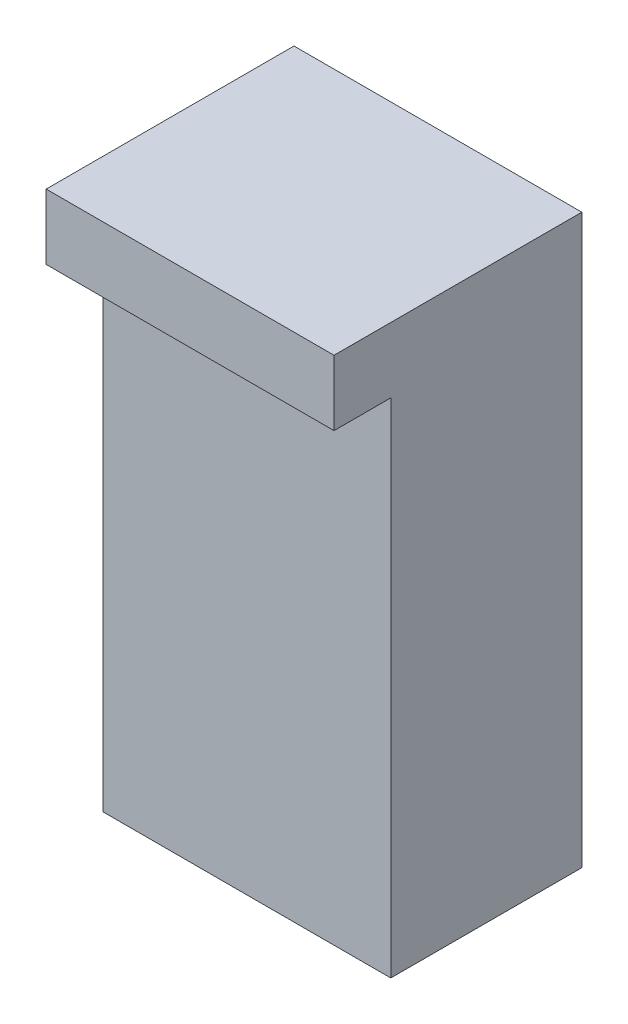
ISO-10303-21;
HEADER;
FILE_DESCRIPTION(('STEP AP214'),'2;1');
FILE_NAME('part.step','',(''),(''),'','','');
FILE_SCHEMA(('AUTOMOTIVE_DESIGN { 1 0 10303 214 1 1 1 1 }'));
ENDSEC;
DATA;
#1=APPLICATION_CONTEXT('core data for automotive mechanical design processes');
#2=APPLICATION_PROTOCOL_DEFINITION('international standard','automotive_design',2000,#1);
#3=PRODUCT_CONTEXT('',#1,'mechanical');
#4=PRODUCT('Part','Part','',(#3));
#5=PRODUCT_RELATED_PRODUCT_CATEGORY('part','',(#4));
#6=PRODUCT_DEFINITION_FORMATION('','',#4);
#7=PRODUCT_DEFINITION_CONTEXT('part definition',#1,'design');
#8=PRODUCT_DEFINITION('design','',#6,#7);
#9=PRODUCT_DEFINITION_SHAPE('','',#8);
#10=(LENGTH_UNIT() NAMED_UNIT(*) SI_UNIT(.MILLI.,.METRE.));
#11=(NAMED_UNIT(*) PLANE_ANGLE_UNIT() SI_UNIT($,.RADIAN.));
#12=(NAMED_UNIT(*) SI_UNIT($,.STERADIAN.) SOLID_ANGLE_UNIT());
#13=UNCERTAINTY_MEASURE_WITH_UNIT(LENGTH_MEASURE(1.E-05),#10,'distance_accuracy_value','');
#14=(GEOMETRIC_REPRESENTATION_CONTEXT(3) GLOBAL_UNCERTAINTY_ASSIGNED_CONTEXT((#13)) GLOBAL_UNIT_ASSIGNED_CONTEXT((#10,
#11,#12)) REPRESENTATION_CONTEXT('',''));
#15=CARTESIAN_POINT('',(0.,0.,0.));
#16=DIRECTION('',(0.,0.,1.));
#17=DIRECTION('',(1.,0.,0.));
#18=AXIS2_PLACEMENT_3D('',#15,#16,#17);
#19=CARTESIAN_POINT('',(12.8778,50.8,8.5471));
#20=DIRECTION('',(0.,0.,-1.));
#21=DIRECTION('',(-1.,0.,0.));
#22=AXIS2_PLACEMENT_3D('',#19,#20,#21);
#23=PLANE('',#22);
#24=DIRECTION('',(1.,0.,0.));
#25=VECTOR('',#24,1.);
#26=CARTESIAN_POINT('',(0.,44.958,8.5471));
#27=LINE('',#26,#25);
#28=CARTESIAN_POINT('',(-12.8778,44.958,8.54710000000001));
#29=VERTEX_POINT('',#28);
#30=CARTESIAN_POINT('',(12.8778,44.958,8.5471));
#31=VERTEX_POINT('',#30);
#32=EDGE_CURVE('E58',#29,#31,#27,.T.);
#33=ORIENTED_EDGE('',*,*,#32,.F.);
#34=DIRECTION('',(0.,-1.,0.));
#35=VECTOR('',#34,1.);
#36=CARTESIAN_POINT('',(-12.8778,50.8,8.54710000000001));
#37=LINE('',#36,#35);
#38=CARTESIAN_POINT('',(-12.8778,0.,8.54710000000001));
#39=VERTEX_POINT('',#38);
#40=EDGE_CURVE('E11',#29,#39,#37,.T.);
#41=ORIENTED_EDGE('',*,*,#40,.T.);
#42=DIRECTION('',(1.,0.,0.));
#43=VECTOR('',#42,1.);
#44=CARTESIAN_POINT('',(12.8778,0.,8.5471));
#45=LINE('',#44,#43);
#46=CARTESIAN_POINT('',(12.8778,0.,8.5471));
#47=VERTEX_POINT('',#46);
#48=EDGE_CURVE('E106',#39,#47,#45,.T.);
#49=ORIENTED_EDGE('',*,*,#48,.T.);
#50=DIRECTION('',(0.,-1.,0.));
#51=VECTOR('',#50,1.);
#52=CARTESIAN_POINT('',(12.8778,50.8,8.5471));
#53=LINE('',#52,#51);
#54=EDGE_CURVE('E53',#31,#47,#53,.T.);
#55=ORIENTED_EDGE('',*,*,#54,.F.);
#56=EDGE_LOOP('',(#33,#41,#49,#55));
#57=FACE_BOUND('',#56,.T.);
#58=ADVANCED_FACE('F44',(#57),#23,.F.);
#59=CARTESIAN_POINT('',(-12.8778,50.8,8.54710000000001));
#60=DIRECTION('',(1.,0.,0.));
#61=DIRECTION('',(0.,0.,-1.));
#62=AXIS2_PLACEMENT_3D('',#59,#60,#61);
#63=PLANE('',#62);
#64=DIRECTION('',(0.,0.,1.));
#65=VECTOR('',#64,1.);
#66=CARTESIAN_POINT('',(-12.8778,0.,8.54710000000001));
#67=LINE('',#66,#65);
#68=CARTESIAN_POINT('',(-12.8778,0.,-8.5471));
#69=VERTEX_POINT('',#68);
#70=EDGE_CURVE('E104',#69,#39,#67,.T.);
#71=ORIENTED_EDGE('',*,*,#70,.T.);
#72=ORIENTED_EDGE('',*,*,#40,.F.);
#73=DIRECTION('',(0.,0.,-1.));
#74=VECTOR('',#73,1.);
#75=CARTESIAN_POINT('',(-12.8778,44.958,13.6271));
#76=LINE('',#75,#74);
#77=CARTESIAN_POINT('',(-12.8778,44.958,13.6271));
#78=VERTEX_POINT('',#77);
#79=EDGE_CURVE('E115',#78,#29,#76,.T.);
#80=ORIENTED_EDGE('',*,*,#79,.F.);
#81=DIRECTION('',(0.,-1.,0.));
#82=VECTOR('',#81,1.);
#83=CARTESIAN_POINT('',(-12.8778,0.,13.6271));
#84=LINE('',#83,#82);
#85=CARTESIAN_POINT('',(-12.8778,50.8,13.6271));
#86=VERTEX_POINT('',#85);
#87=EDGE_CURVE('E150',#86,#78,#84,.T.);
#88=ORIENTED_EDGE('',*,*,#87,.F.);
#89=DIRECTION('',(0.,0.,1.));
#90=VECTOR('',#89,1.);
#91=CARTESIAN_POINT('',(-12.8778,50.8,8.54710000000001));
#92=LINE('',#91,#90);
#93=CARTESIAN_POINT('',(-12.8778,50.8,-8.5471));
#94=VERTEX_POINT('',#93);
#95=EDGE_CURVE('E97',#94,#86,#92,.T.);
#96=ORIENTED_EDGE('',*,*,#95,.F.);
#97=DIRECTION('',(0.,-1.,0.));
#98=VECTOR('',#97,1.);
#99=CARTESIAN_POINT('',(-12.8778,50.8,-8.5471));
#100=LINE('',#99,#98);
#101=EDGE_CURVE('E89',#94,#69,#100,.T.);
#102=ORIENTED_EDGE('',*,*,#101,.T.);
#103=EDGE_LOOP('',(#71,#72,#80,#88,#96,#102));
#104=FACE_BOUND('',#103,.T.);
#105=ADVANCED_FACE('F50',(#104),#63,.F.);
#106=CARTESIAN_POINT('',(12.8778,50.8,8.5471));
#107=DIRECTION('',(-1.,0.,0.));
#108=DIRECTION('',(0.,0.,1.));
#109=AXIS2_PLACEMENT_3D('',#106,#107,#108);
#110=PLANE('',#109);
#111=DIRECTION('',(0.,0.,-1.));
#112=VECTOR('',#111,1.);
#113=CARTESIAN_POINT('',(12.8778,0.,8.5471));
#114=LINE('',#113,#112);
#115=CARTESIAN_POINT('',(12.8778,0.,-8.5471));
#116=VERTEX_POINT('',#115);
#117=EDGE_CURVE('E98',#47,#116,#114,.T.);
#118=ORIENTED_EDGE('',*,*,#117,.T.);
#119=DIRECTION('',(0.,-1.,0.));
#120=VECTOR('',#119,1.);
#121=CARTESIAN_POINT('',(12.8778,50.8,-8.5471));
#122=LINE('',#121,#120);
#123=CARTESIAN_POINT('',(12.8778,50.8,-8.5471));
#124=VERTEX_POINT('',#123);
#125=EDGE_CURVE('E93',#124,#116,#122,.T.);
#126=ORIENTED_EDGE('',*,*,#125,.F.);
#127=DIRECTION('',(0.,0.,-1.));
#128=VECTOR('',#127,1.);
#129=CARTESIAN_POINT('',(12.8778,50.8,8.5471));
#130=LINE('',#129,#128);
#131=CARTESIAN_POINT('',(12.8778,50.8,13.6271));
#132=VERTEX_POINT('',#131);
#133=EDGE_CURVE('E161',#132,#124,#130,.T.);
#134=ORIENTED_EDGE('',*,*,#133,.F.);
#135=DIRECTION('',(0.,1.,0.));
#136=VECTOR('',#135,1.);
#137=CARTESIAN_POINT('',(12.8778,0.,13.6271));
#138=LINE('',#137,#136);
#139=CARTESIAN_POINT('',(12.8778,44.958,13.6271));
#140=VERTEX_POINT('',#139);
#141=EDGE_CURVE('E147',#140,#132,#138,.T.);
#142=ORIENTED_EDGE('',*,*,#141,.F.);
#143=DIRECTION('',(0.,0.,-1.));
#144=VECTOR('',#143,1.);
#145=CARTESIAN_POINT('',(12.8778,44.958,13.6271));
#146=LINE('',#145,#144);
#147=EDGE_CURVE('E118',#140,#31,#146,.T.);
#148=ORIENTED_EDGE('',*,*,#147,.T.);
#149=ORIENTED_EDGE('',*,*,#54,.T.);
#150=EDGE_LOOP('',(#118,#126,#134,#142,#148,#149));
#151=FACE_BOUND('',#150,.T.);
#152=ADVANCED_FACE('F129',(#151),#110,.F.);
#153=CARTESIAN_POINT('',(12.8778,50.8,-8.5471));
#154=DIRECTION('',(0.,0.,1.));
#155=DIRECTION('',(1.,0.,0.));
#156=AXIS2_PLACEMENT_3D('',#153,#154,#155);
#157=PLANE('',#156);
#158=DIRECTION('',(-1.,0.,0.));
#159=VECTOR('',#158,1.);
#160=CARTESIAN_POINT('',(12.8778,0.,-8.5471));
#161=LINE('',#160,#159);
#162=EDGE_CURVE('E90',#116,#69,#161,.T.);
#163=ORIENTED_EDGE('',*,*,#162,.T.);
#164=ORIENTED_EDGE('',*,*,#101,.F.);
#165=DIRECTION('',(-1.,0.,0.));
#166=VECTOR('',#165,1.);
#167=CARTESIAN_POINT('',(12.8778,50.8,-8.5471));
#168=LINE('',#167,#166);
#169=EDGE_CURVE('E69',#124,#94,#168,.T.);
#170=ORIENTED_EDGE('',*,*,#169,.F.);
#171=ORIENTED_EDGE('',*,*,#125,.T.);
#172=EDGE_LOOP('',(#163,#164,#170,#171));
#173=FACE_BOUND('',#172,.T.);
#174=ADVANCED_FACE('F87',(#173),#157,.F.);
#175=CARTESIAN_POINT('',(0.,50.8,0.));
#176=DIRECTION('',(0.,1.,0.));
#177=DIRECTION('',(0.,0.,1.));
#178=AXIS2_PLACEMENT_3D('',#175,#176,#177);
#179=PLANE('',#178);
#180=ORIENTED_EDGE('',*,*,#95,.T.);
#181=DIRECTION('',(-1.,0.,0.));
#182=VECTOR('',#181,1.);
#183=CARTESIAN_POINT('',(0.,50.8,13.6271));
#184=LINE('',#183,#182);
#185=EDGE_CURVE('E155',#132,#86,#184,.T.);
#186=ORIENTED_EDGE('',*,*,#185,.F.);
#187=ORIENTED_EDGE('',*,*,#133,.T.);
#188=ORIENTED_EDGE('',*,*,#169,.T.);
#189=EDGE_LOOP('',(#180,#186,#187,#188));
#190=FACE_BOUND('',#189,.T.);
#191=ADVANCED_FACE('F170',(#190),#179,.T.);
#192=CARTESIAN_POINT('',(0.,0.,0.));
#193=DIRECTION('',(0.,1.,0.));
#194=DIRECTION('',(0.,0.,1.));
#195=AXIS2_PLACEMENT_3D('',#192,#193,#194);
#196=PLANE('',#195);
#197=ORIENTED_EDGE('',*,*,#70,.F.);
#198=ORIENTED_EDGE('',*,*,#162,.F.);
#199=ORIENTED_EDGE('',*,*,#117,.F.);
#200=ORIENTED_EDGE('',*,*,#48,.F.);
#201=EDGE_LOOP('',(#197,#198,#199,#200));
#202=FACE_BOUND('',#201,.T.);
#203=ADVANCED_FACE('F108',(#202),#196,.F.);
#204=CARTESIAN_POINT('',(0.,44.958,13.6271));
#205=DIRECTION('',(0.,1.,0.));
#206=DIRECTION('',(0.,0.,1.));
#207=AXIS2_PLACEMENT_3D('',#204,#205,#206);
#208=PLANE('',#207);
#209=ORIENTED_EDGE('',*,*,#32,.T.);
#210=ORIENTED_EDGE('',*,*,#147,.F.);
#211=DIRECTION('',(1.,0.,0.));
#212=VECTOR('',#211,1.);
#213=CARTESIAN_POINT('',(0.,44.958,13.6271));
#214=LINE('',#213,#212);
#215=EDGE_CURVE('E137',#78,#140,#214,.T.);
#216=ORIENTED_EDGE('',*,*,#215,.F.);
#217=ORIENTED_EDGE('',*,*,#79,.T.);
#218=EDGE_LOOP('',(#209,#210,#216,#217));
#219=FACE_BOUND('',#218,.T.);
#220=ADVANCED_FACE('F140',(#219),#208,.F.);
#221=CARTESIAN_POINT('',(0.,0.,13.6271));
#222=DIRECTION('',(0.,0.,1.));
#223=DIRECTION('',(1.,0.,0.));
#224=AXIS2_PLACEMENT_3D('',#221,#222,#223);
#225=PLANE('',#224);
#226=ORIENTED_EDGE('',*,*,#87,.T.);
#227=ORIENTED_EDGE('',*,*,#215,.T.);
#228=ORIENTED_EDGE('',*,*,#141,.T.);
#229=ORIENTED_EDGE('',*,*,#185,.T.);
#230=EDGE_LOOP('',(#226,#227,#228,#229));
#231=FACE_BOUND('',#230,.T.);
#232=ADVANCED_FACE('F148',(#231),#225,.T.);
#233=CLOSED_SHELL('',(#58,#105,#152,#174,#191,#203,#220,#232));
#234=MANIFOLD_SOLID_BREP('B2',#233);
#235=ADVANCED_BREP_SHAPE_REPRESENTATION('',(#18,#234),#14);
#236=SHAPE_DEFINITION_REPRESENTATION(#9,#235);
ENDSEC;
END-ISO-10303-21;
